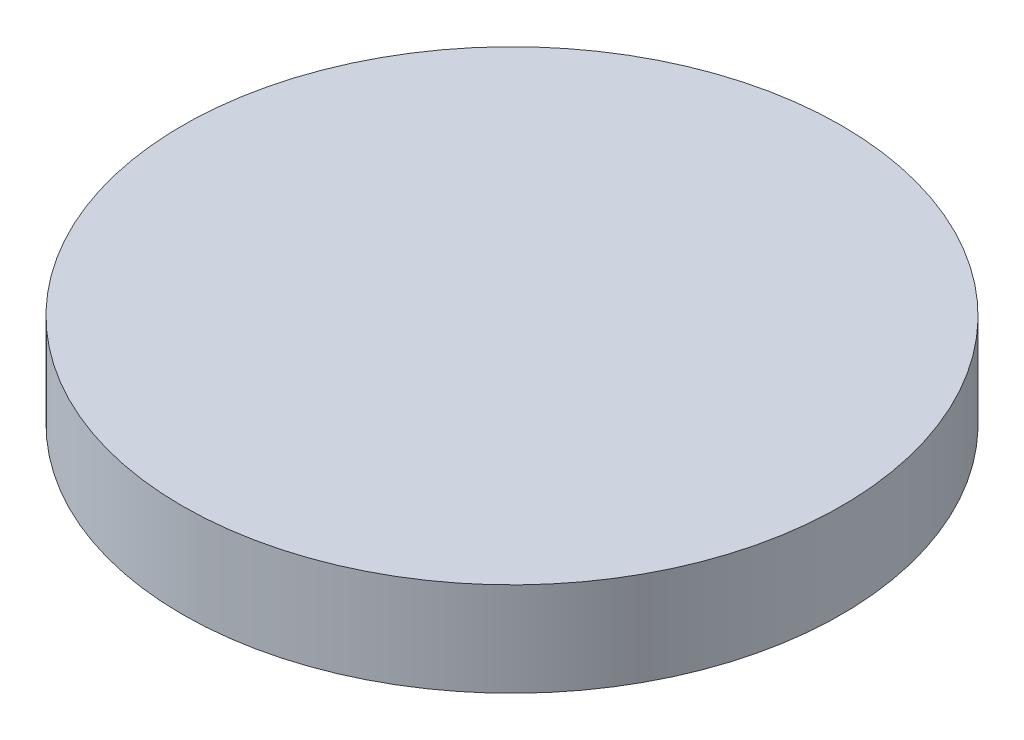
ISO-10303-21;
HEADER;
FILE_DESCRIPTION(('STEP AP214'),'2;1');
FILE_NAME('part.step','',(''),(''),'','','');
FILE_SCHEMA(('AUTOMOTIVE_DESIGN { 1 0 10303 214 1 1 1 1 }'));
ENDSEC;
DATA;
#1=APPLICATION_CONTEXT('core data for automotive mechanical design processes');
#2=APPLICATION_PROTOCOL_DEFINITION('international standard','automotive_design',2000,#1);
#3=PRODUCT_CONTEXT('',#1,'mechanical');
#4=PRODUCT('Part','Part','',(#3));
#5=PRODUCT_RELATED_PRODUCT_CATEGORY('part','',(#4));
#6=PRODUCT_DEFINITION_FORMATION('','',#4);
#7=PRODUCT_DEFINITION_CONTEXT('part definition',#1,'design');
#8=PRODUCT_DEFINITION('design','',#6,#7);
#9=PRODUCT_DEFINITION_SHAPE('','',#8);
#10=(LENGTH_UNIT() NAMED_UNIT(*) SI_UNIT(.MILLI.,.METRE.));
#11=(NAMED_UNIT(*) PLANE_ANGLE_UNIT() SI_UNIT($,.RADIAN.));
#12=(NAMED_UNIT(*) SI_UNIT($,.STERADIAN.) SOLID_ANGLE_UNIT());
#13=UNCERTAINTY_MEASURE_WITH_UNIT(LENGTH_MEASURE(1.E-05),#10,'distance_accuracy_value','');
#14=(GEOMETRIC_REPRESENTATION_CONTEXT(3) GLOBAL_UNCERTAINTY_ASSIGNED_CONTEXT((#13)) GLOBAL_UNIT_ASSIGNED_CONTEXT((#10,
#11,#12)) REPRESENTATION_CONTEXT('',''));
#15=CARTESIAN_POINT('',(0.,0.,0.));
#16=DIRECTION('',(0.,0.,1.));
#17=DIRECTION('',(1.,0.,0.));
#18=AXIS2_PLACEMENT_3D('',#15,#16,#17);
#19=CARTESIAN_POINT('',(0.,10.,0.));
#20=DIRECTION('',(0.,-1.,0.));
#21=DIRECTION('',(0.,0.,-1.));
#22=AXIS2_PLACEMENT_3D('',#19,#20,#21);
#23=CYLINDRICAL_SURFACE('',#22,35.1042397283197);
#24=CARTESIAN_POINT('',(0.,10.,0.));
#25=DIRECTION('',(0.,1.,0.));
#26=DIRECTION('',(0.,0.,1.));
#27=AXIS2_PLACEMENT_3D('',#24,#25,#26);
#28=CIRCLE('',#27,35.1042397283197);
#29=CARTESIAN_POINT('',(0.,10.,35.1042397283197));
#30=VERTEX_POINT('',#29);
#31=EDGE_CURVE('E10',#30,#30,#28,.T.);
#32=ORIENTED_EDGE('',*,*,#31,.F.);
#33=EDGE_LOOP('',(#32));
#34=FACE_BOUND('',#33,.T.);
#35=CARTESIAN_POINT('',(0.,0.,0.));
#36=DIRECTION('',(0.,1.,0.));
#37=DIRECTION('',(0.,0.,1.));
#38=AXIS2_PLACEMENT_3D('',#35,#36,#37);
#39=CIRCLE('',#38,35.1042397283197);
#40=CARTESIAN_POINT('',(0.,0.,35.1042397283197));
#41=VERTEX_POINT('',#40);
#42=EDGE_CURVE('E40',#41,#41,#39,.T.);
#43=ORIENTED_EDGE('',*,*,#42,.T.);
#44=EDGE_LOOP('',(#43));
#45=FACE_BOUND('',#44,.T.);
#46=ADVANCED_FACE('F37',(#34,#45),#23,.T.);
#47=CARTESIAN_POINT('',(0.,10.,0.));
#48=DIRECTION('',(0.,1.,0.));
#49=DIRECTION('',(0.,0.,1.));
#50=AXIS2_PLACEMENT_3D('',#47,#48,#49);
#51=PLANE('',#50);
#52=ORIENTED_EDGE('',*,*,#31,.T.);
#53=EDGE_LOOP('',(#52));
#54=FACE_BOUND('',#53,.T.);
#55=ADVANCED_FACE('F54',(#54),#51,.T.);
#56=CARTESIAN_POINT('',(0.,0.,0.));
#57=DIRECTION('',(0.,1.,0.));
#58=DIRECTION('',(0.,0.,1.));
#59=AXIS2_PLACEMENT_3D('',#56,#57,#58);
#60=PLANE('',#59);
#61=ORIENTED_EDGE('',*,*,#42,.F.);
#62=EDGE_LOOP('',(#61));
#63=FACE_BOUND('',#62,.T.);
#64=ADVANCED_FACE('F52',(#63),#60,.F.);
#65=CLOSED_SHELL('',(#46,#55,#64));
#66=MANIFOLD_SOLID_BREP('B2',#65);
#67=ADVANCED_BREP_SHAPE_REPRESENTATION('',(#18,#66),#14);
#68=SHAPE_DEFINITION_REPRESENTATION(#9,#67);
ENDSEC;
END-ISO-10303-21;
